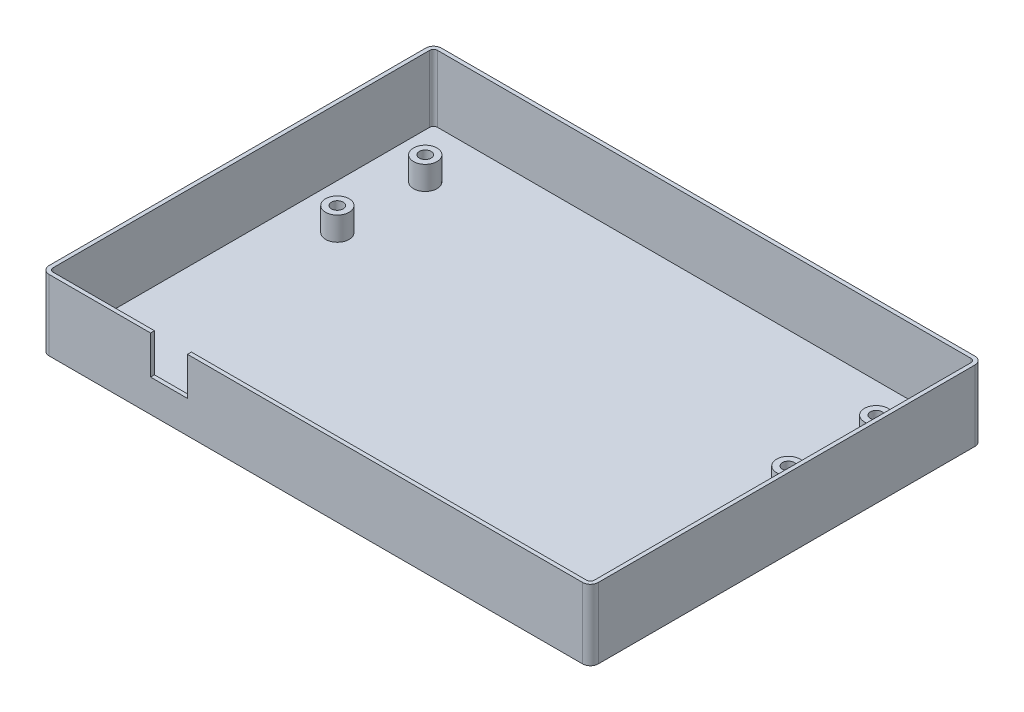
ISO-10303-21;
HEADER;
FILE_DESCRIPTION(('STEP AP214'),'2;1');
FILE_NAME('part.step','',(''),(''),'','','');
FILE_SCHEMA(('AUTOMOTIVE_DESIGN { 1 0 10303 214 1 1 1 1 }'));
ENDSEC;
DATA;
#1=APPLICATION_CONTEXT('core data for automotive mechanical design processes');
#2=APPLICATION_PROTOCOL_DEFINITION('international standard','automotive_design',2000,#1);
#3=PRODUCT_CONTEXT('',#1,'mechanical');
#4=PRODUCT('Part','Part','',(#3));
#5=PRODUCT_RELATED_PRODUCT_CATEGORY('part','',(#4));
#6=PRODUCT_DEFINITION_FORMATION('','',#4);
#7=PRODUCT_DEFINITION_CONTEXT('part definition',#1,'design');
#8=PRODUCT_DEFINITION('design','',#6,#7);
#9=PRODUCT_DEFINITION_SHAPE('','',#8);
#10=(LENGTH_UNIT() NAMED_UNIT(*) SI_UNIT(.MILLI.,.METRE.));
#11=(NAMED_UNIT(*) PLANE_ANGLE_UNIT() SI_UNIT($,.RADIAN.));
#12=(NAMED_UNIT(*) SI_UNIT($,.STERADIAN.) SOLID_ANGLE_UNIT());
#13=UNCERTAINTY_MEASURE_WITH_UNIT(LENGTH_MEASURE(1.E-05),#10,'distance_accuracy_value','');
#14=(GEOMETRIC_REPRESENTATION_CONTEXT(3) GLOBAL_UNCERTAINTY_ASSIGNED_CONTEXT((#13)) GLOBAL_UNIT_ASSIGNED_CONTEXT((#10,
#11,#12)) REPRESENTATION_CONTEXT('',''));
#15=CARTESIAN_POINT('',(0.,0.,0.));
#16=DIRECTION('',(0.,0.,1.));
#17=DIRECTION('',(1.,0.,0.));
#18=AXIS2_PLACEMENT_3D('',#15,#16,#17);
#19=CARTESIAN_POINT('',(68.,-3.,48.));
#20=DIRECTION('',(0.,1.,0.));
#21=DIRECTION('',(0.,0.,1.));
#22=AXIS2_PLACEMENT_3D('',#19,#20,#21);
#23=CYLINDRICAL_SURFACE('',#22,2.00000000000001);
#24=DIRECTION('',(0.,1.,0.));
#25=VECTOR('',#24,1.);
#26=CARTESIAN_POINT('',(70.,-3.,48.));
#27=LINE('',#26,#25);
#28=CARTESIAN_POINT('',(70.,-3.,48.));
#29=VERTEX_POINT('',#28);
#30=CARTESIAN_POINT('',(70.,15.,48.));
#31=VERTEX_POINT('',#30);
#32=EDGE_CURVE('E415',#29,#31,#27,.T.);
#33=ORIENTED_EDGE('',*,*,#32,.T.);
#34=CARTESIAN_POINT('',(68.,15.,48.));
#35=DIRECTION('',(0.,1.,0.));
#36=DIRECTION('',(0.,0.,1.));
#37=AXIS2_PLACEMENT_3D('',#34,#35,#36);
#38=CIRCLE('',#37,2.00000000000001);
#39=CARTESIAN_POINT('',(68.,15.,50.));
#40=VERTEX_POINT('',#39);
#41=EDGE_CURVE('E273',#40,#31,#38,.T.);
#42=ORIENTED_EDGE('',*,*,#41,.F.);
#43=DIRECTION('',(0.,1.,0.));
#44=VECTOR('',#43,1.);
#45=CARTESIAN_POINT('',(68.,-3.,50.));
#46=LINE('',#45,#44);
#47=CARTESIAN_POINT('',(68.,-3.,50.));
#48=VERTEX_POINT('',#47);
#49=EDGE_CURVE('E416',#48,#40,#46,.T.);
#50=ORIENTED_EDGE('',*,*,#49,.F.);
#51=CARTESIAN_POINT('',(68.,-3.,48.));
#52=DIRECTION('',(0.,1.,0.));
#53=DIRECTION('',(0.,0.,1.));
#54=AXIS2_PLACEMENT_3D('',#51,#52,#53);
#55=CIRCLE('',#54,2.00000000000001);
#56=EDGE_CURVE('E383',#48,#29,#55,.T.);
#57=ORIENTED_EDGE('',*,*,#56,.T.);
#58=EDGE_LOOP('',(#33,#42,#50,#57));
#59=FACE_BOUND('',#58,.T.);
#60=ADVANCED_FACE('F44',(#59),#23,.T.);
#61=CARTESIAN_POINT('',(-68.,-3.,50.));
#62=DIRECTION('',(0.,0.,1.));
#63=DIRECTION('',(1.,0.,0.));
#64=AXIS2_PLACEMENT_3D('',#61,#62,#63);
#65=PLANE('',#64);
#66=DIRECTION('',(0.,-1.,0.));
#67=VECTOR('',#66,1.);
#68=CARTESIAN_POINT('',(-42.167215363372,5.26014807806429,50.));
#69=LINE('',#68,#67);
#70=CARTESIAN_POINT('',(-42.167215363372,15.,50.));
#71=VERTEX_POINT('',#70);
#72=CARTESIAN_POINT('',(-42.167215363372,5.26014807806429,50.));
#73=VERTEX_POINT('',#72);
#74=EDGE_CURVE('E181',#71,#73,#69,.T.);
#75=ORIENTED_EDGE('',*,*,#74,.F.);
#76=DIRECTION('',(1.,0.,0.));
#77=VECTOR('',#76,1.);
#78=CARTESIAN_POINT('',(-68.,15.,50.));
#79=LINE('',#78,#77);
#80=CARTESIAN_POINT('',(-68.,15.,50.));
#81=VERTEX_POINT('',#80);
#82=EDGE_CURVE('E380',#81,#71,#79,.T.);
#83=ORIENTED_EDGE('',*,*,#82,.F.);
#84=DIRECTION('',(0.,1.,0.));
#85=VECTOR('',#84,1.);
#86=CARTESIAN_POINT('',(-68.,-3.,50.));
#87=LINE('',#86,#85);
#88=CARTESIAN_POINT('',(-68.,-3.,50.));
#89=VERTEX_POINT('',#88);
#90=EDGE_CURVE('E421',#89,#81,#87,.T.);
#91=ORIENTED_EDGE('',*,*,#90,.F.);
#92=DIRECTION('',(1.,0.,0.));
#93=VECTOR('',#92,1.);
#94=CARTESIAN_POINT('',(-68.,-3.,50.));
#95=LINE('',#94,#93);
#96=EDGE_CURVE('E411',#89,#48,#95,.T.);
#97=ORIENTED_EDGE('',*,*,#96,.T.);
#98=ORIENTED_EDGE('',*,*,#49,.T.);
#99=CARTESIAN_POINT('',(-32.7429575177416,15.,50.));
#100=VERTEX_POINT('',#99);
#101=EDGE_CURVE('E379',#100,#40,#79,.T.);
#102=ORIENTED_EDGE('',*,*,#101,.F.);
#103=DIRECTION('',(0.,1.,0.));
#104=VECTOR('',#103,1.);
#105=CARTESIAN_POINT('',(-32.7429575177416,5.26014807806429,50.));
#106=LINE('',#105,#104);
#107=CARTESIAN_POINT('',(-32.7429575177416,5.26014807806429,50.));
#108=VERTEX_POINT('',#107);
#109=EDGE_CURVE('E199',#108,#100,#106,.T.);
#110=ORIENTED_EDGE('',*,*,#109,.F.);
#111=DIRECTION('',(1.,0.,0.));
#112=VECTOR('',#111,1.);
#113=CARTESIAN_POINT('',(-42.167215363372,5.26014807806429,50.));
#114=LINE('',#113,#112);
#115=EDGE_CURVE('E192',#73,#108,#114,.T.);
#116=ORIENTED_EDGE('',*,*,#115,.F.);
#117=EDGE_LOOP('',(#75,#83,#91,#97,#98,#102,#110,#116));
#118=FACE_BOUND('',#117,.T.);
#119=ADVANCED_FACE('F201',(#118),#65,.T.);
#120=CARTESIAN_POINT('',(-68.,-3.,48.));
#121=DIRECTION('',(0.,1.,0.));
#122=DIRECTION('',(0.,0.,1.));
#123=AXIS2_PLACEMENT_3D('',#120,#121,#122);
#124=CYLINDRICAL_SURFACE('',#123,2.);
#125=ORIENTED_EDGE('',*,*,#90,.T.);
#126=CARTESIAN_POINT('',(-68.,15.,48.));
#127=DIRECTION('',(0.,1.,0.));
#128=DIRECTION('',(0.,0.,-1.));
#129=AXIS2_PLACEMENT_3D('',#126,#127,#128);
#130=CIRCLE('',#129,2.);
#131=CARTESIAN_POINT('',(-70.,15.,48.));
#132=VERTEX_POINT('',#131);
#133=EDGE_CURVE('E375',#132,#81,#130,.T.);
#134=ORIENTED_EDGE('',*,*,#133,.F.);
#135=DIRECTION('',(0.,1.,0.));
#136=VECTOR('',#135,1.);
#137=CARTESIAN_POINT('',(-70.,-3.,48.));
#138=LINE('',#137,#136);
#139=CARTESIAN_POINT('',(-70.,-3.,48.));
#140=VERTEX_POINT('',#139);
#141=EDGE_CURVE('E424',#140,#132,#138,.T.);
#142=ORIENTED_EDGE('',*,*,#141,.F.);
#143=CARTESIAN_POINT('',(-68.,-3.,48.));
#144=DIRECTION('',(0.,1.,0.));
#145=DIRECTION('',(0.,0.,-1.));
#146=AXIS2_PLACEMENT_3D('',#143,#144,#145);
#147=CIRCLE('',#146,2.);
#148=EDGE_CURVE('E407',#140,#89,#147,.T.);
#149=ORIENTED_EDGE('',*,*,#148,.T.);
#150=EDGE_LOOP('',(#125,#134,#142,#149));
#151=FACE_BOUND('',#150,.T.);
#152=ADVANCED_FACE('F499',(#151),#124,.T.);
#153=CARTESIAN_POINT('',(-70.,-3.,48.));
#154=DIRECTION('',(-1.,0.,0.));
#155=DIRECTION('',(0.,0.,1.));
#156=AXIS2_PLACEMENT_3D('',#153,#154,#155);
#157=PLANE('',#156);
#158=ORIENTED_EDGE('',*,*,#141,.T.);
#159=DIRECTION('',(0.,0.,1.));
#160=VECTOR('',#159,1.);
#161=CARTESIAN_POINT('',(-70.,15.,48.));
#162=LINE('',#161,#160);
#163=CARTESIAN_POINT('',(-70.,15.,-48.));
#164=VERTEX_POINT('',#163);
#165=EDGE_CURVE('E371',#164,#132,#162,.T.);
#166=ORIENTED_EDGE('',*,*,#165,.F.);
#167=DIRECTION('',(0.,1.,0.));
#168=VECTOR('',#167,1.);
#169=CARTESIAN_POINT('',(-70.,-3.,-48.));
#170=LINE('',#169,#168);
#171=CARTESIAN_POINT('',(-70.,-3.,-48.));
#172=VERTEX_POINT('',#171);
#173=EDGE_CURVE('E427',#172,#164,#170,.T.);
#174=ORIENTED_EDGE('',*,*,#173,.F.);
#175=DIRECTION('',(0.,0.,1.));
#176=VECTOR('',#175,1.);
#177=CARTESIAN_POINT('',(-70.,-3.,48.));
#178=LINE('',#177,#176);
#179=EDGE_CURVE('E403',#172,#140,#178,.T.);
#180=ORIENTED_EDGE('',*,*,#179,.T.);
#181=EDGE_LOOP('',(#158,#166,#174,#180));
#182=FACE_BOUND('',#181,.T.);
#183=ADVANCED_FACE('F497',(#182),#157,.T.);
#184=CARTESIAN_POINT('',(-68.,-3.,-48.));
#185=DIRECTION('',(0.,1.,0.));
#186=DIRECTION('',(0.,0.,1.));
#187=AXIS2_PLACEMENT_3D('',#184,#185,#186);
#188=CYLINDRICAL_SURFACE('',#187,2.);
#189=ORIENTED_EDGE('',*,*,#173,.T.);
#190=CARTESIAN_POINT('',(-68.,15.,-48.));
#191=DIRECTION('',(0.,1.,0.));
#192=DIRECTION('',(0.,0.,-1.));
#193=AXIS2_PLACEMENT_3D('',#190,#191,#192);
#194=CIRCLE('',#193,2.);
#195=CARTESIAN_POINT('',(-68.,15.,-50.));
#196=VERTEX_POINT('',#195);
#197=EDGE_CURVE('E367',#196,#164,#194,.T.);
#198=ORIENTED_EDGE('',*,*,#197,.F.);
#199=DIRECTION('',(0.,1.,0.));
#200=VECTOR('',#199,1.);
#201=CARTESIAN_POINT('',(-68.,-3.,-50.));
#202=LINE('',#201,#200);
#203=CARTESIAN_POINT('',(-68.,-3.,-50.));
#204=VERTEX_POINT('',#203);
#205=EDGE_CURVE('E430',#204,#196,#202,.T.);
#206=ORIENTED_EDGE('',*,*,#205,.F.);
#207=CARTESIAN_POINT('',(-68.,-3.,-48.));
#208=DIRECTION('',(0.,1.,0.));
#209=DIRECTION('',(0.,0.,-1.));
#210=AXIS2_PLACEMENT_3D('',#207,#208,#209);
#211=CIRCLE('',#210,2.);
#212=EDGE_CURVE('E399',#204,#172,#211,.T.);
#213=ORIENTED_EDGE('',*,*,#212,.T.);
#214=EDGE_LOOP('',(#189,#198,#206,#213));
#215=FACE_BOUND('',#214,.T.);
#216=ADVANCED_FACE('F492',(#215),#188,.T.);
#217=CARTESIAN_POINT('',(-68.,-3.,-50.));
#218=DIRECTION('',(0.,0.,-1.));
#219=DIRECTION('',(-1.,0.,0.));
#220=AXIS2_PLACEMENT_3D('',#217,#218,#219);
#221=PLANE('',#220);
#222=ORIENTED_EDGE('',*,*,#205,.T.);
#223=DIRECTION('',(-1.,0.,0.));
#224=VECTOR('',#223,1.);
#225=CARTESIAN_POINT('',(-68.,15.,-50.));
#226=LINE('',#225,#224);
#227=CARTESIAN_POINT('',(68.,15.,-50.));
#228=VERTEX_POINT('',#227);
#229=EDGE_CURVE('E363',#228,#196,#226,.T.);
#230=ORIENTED_EDGE('',*,*,#229,.F.);
#231=DIRECTION('',(0.,1.,0.));
#232=VECTOR('',#231,1.);
#233=CARTESIAN_POINT('',(68.,-3.,-50.));
#234=LINE('',#233,#232);
#235=CARTESIAN_POINT('',(68.,-3.,-50.));
#236=VERTEX_POINT('',#235);
#237=EDGE_CURVE('E433',#236,#228,#234,.T.);
#238=ORIENTED_EDGE('',*,*,#237,.F.);
#239=DIRECTION('',(-1.,0.,0.));
#240=VECTOR('',#239,1.);
#241=CARTESIAN_POINT('',(-68.,-3.,-50.));
#242=LINE('',#241,#240);
#243=EDGE_CURVE('E395',#236,#204,#242,.T.);
#244=ORIENTED_EDGE('',*,*,#243,.T.);
#245=EDGE_LOOP('',(#222,#230,#238,#244));
#246=FACE_BOUND('',#245,.T.);
#247=ADVANCED_FACE('F485',(#246),#221,.T.);
#248=CARTESIAN_POINT('',(68.,-3.,-48.));
#249=DIRECTION('',(0.,1.,0.));
#250=DIRECTION('',(0.,0.,1.));
#251=AXIS2_PLACEMENT_3D('',#248,#249,#250);
#252=CYLINDRICAL_SURFACE('',#251,2.00000000000001);
#253=ORIENTED_EDGE('',*,*,#237,.T.);
#254=CARTESIAN_POINT('',(68.,15.,-48.));
#255=DIRECTION('',(0.,1.,0.));
#256=DIRECTION('',(0.,0.,-1.));
#257=AXIS2_PLACEMENT_3D('',#254,#255,#256);
#258=CIRCLE('',#257,2.00000000000001);
#259=CARTESIAN_POINT('',(70.,15.,-48.));
#260=VERTEX_POINT('',#259);
#261=EDGE_CURVE('E359',#260,#228,#258,.T.);
#262=ORIENTED_EDGE('',*,*,#261,.F.);
#263=DIRECTION('',(0.,1.,0.));
#264=VECTOR('',#263,1.);
#265=CARTESIAN_POINT('',(70.,-3.,-48.));
#266=LINE('',#265,#264);
#267=CARTESIAN_POINT('',(70.,-3.,-48.));
#268=VERTEX_POINT('',#267);
#269=EDGE_CURVE('E436',#268,#260,#266,.T.);
#270=ORIENTED_EDGE('',*,*,#269,.F.);
#271=CARTESIAN_POINT('',(68.,-3.,-48.));
#272=DIRECTION('',(0.,1.,0.));
#273=DIRECTION('',(0.,0.,-1.));
#274=AXIS2_PLACEMENT_3D('',#271,#272,#273);
#275=CIRCLE('',#274,2.00000000000001);
#276=EDGE_CURVE('E391',#268,#236,#275,.T.);
#277=ORIENTED_EDGE('',*,*,#276,.T.);
#278=EDGE_LOOP('',(#253,#262,#270,#277));
#279=FACE_BOUND('',#278,.T.);
#280=ADVANCED_FACE('F481',(#279),#252,.T.);
#281=CARTESIAN_POINT('',(70.,-3.,48.));
#282=DIRECTION('',(1.,0.,0.));
#283=DIRECTION('',(0.,0.,-1.));
#284=AXIS2_PLACEMENT_3D('',#281,#282,#283);
#285=PLANE('',#284);
#286=ORIENTED_EDGE('',*,*,#269,.T.);
#287=DIRECTION('',(0.,0.,-1.));
#288=VECTOR('',#287,1.);
#289=CARTESIAN_POINT('',(70.,15.,48.));
#290=LINE('',#289,#288);
#291=EDGE_CURVE('E355',#31,#260,#290,.T.);
#292=ORIENTED_EDGE('',*,*,#291,.F.);
#293=ORIENTED_EDGE('',*,*,#32,.F.);
#294=DIRECTION('',(0.,0.,-1.));
#295=VECTOR('',#294,1.);
#296=CARTESIAN_POINT('',(70.,-3.,48.));
#297=LINE('',#296,#295);
#298=EDGE_CURVE('E387',#29,#268,#297,.T.);
#299=ORIENTED_EDGE('',*,*,#298,.T.);
#300=EDGE_LOOP('',(#286,#292,#293,#299));
#301=FACE_BOUND('',#300,.T.);
#302=ADVANCED_FACE('F477',(#301),#285,.T.);
#303=CARTESIAN_POINT('',(68.,-3.,48.));
#304=DIRECTION('',(0.,1.,0.));
#305=DIRECTION('',(0.,0.,1.));
#306=AXIS2_PLACEMENT_3D('',#303,#304,#305);
#307=PLANE('',#306);
#308=ORIENTED_EDGE('',*,*,#56,.F.);
#309=ORIENTED_EDGE('',*,*,#96,.F.);
#310=ORIENTED_EDGE('',*,*,#148,.F.);
#311=ORIENTED_EDGE('',*,*,#179,.F.);
#312=ORIENTED_EDGE('',*,*,#212,.F.);
#313=ORIENTED_EDGE('',*,*,#243,.F.);
#314=ORIENTED_EDGE('',*,*,#276,.F.);
#315=ORIENTED_EDGE('',*,*,#298,.F.);
#316=EDGE_LOOP('',(#308,#309,#310,#311,#312,#313,#314,#315));
#317=FACE_BOUND('',#316,.T.);
#318=ADVANCED_FACE('F488',(#317),#307,.F.);
#319=CARTESIAN_POINT('',(68.,15.,48.));
#320=DIRECTION('',(0.,1.,0.));
#321=DIRECTION('',(0.,0.,1.));
#322=AXIS2_PLACEMENT_3D('',#319,#320,#321);
#323=PLANE('',#322);
#324=DIRECTION('',(0.,0.,1.));
#325=VECTOR('',#324,1.);
#326=CARTESIAN_POINT('',(-42.167215363372,15.,48.));
#327=LINE('',#326,#325);
#328=CARTESIAN_POINT('',(-42.167215363372,15.,49.));
#329=VERTEX_POINT('',#328);
#330=EDGE_CURVE('E186',#329,#71,#327,.T.);
#331=ORIENTED_EDGE('',*,*,#330,.F.);
#332=DIRECTION('',(1.,0.,0.));
#333=VECTOR('',#332,1.);
#334=CARTESIAN_POINT('',(68.,15.,49.));
#335=LINE('',#334,#333);
#336=CARTESIAN_POINT('',(-68.,15.,49.));
#337=VERTEX_POINT('',#336);
#338=EDGE_CURVE('E280',#337,#329,#335,.T.);
#339=ORIENTED_EDGE('',*,*,#338,.F.);
#340=CARTESIAN_POINT('',(-68.,15.,48.));
#341=DIRECTION('',(0.,1.,0.));
#342=DIRECTION('',(0.,0.,1.));
#343=AXIS2_PLACEMENT_3D('',#340,#341,#342);
#344=CIRCLE('',#343,1.);
#345=CARTESIAN_POINT('',(-69.,15.,48.));
#346=VERTEX_POINT('',#345);
#347=EDGE_CURVE('E67',#346,#337,#344,.T.);
#348=ORIENTED_EDGE('',*,*,#347,.F.);
#349=DIRECTION('',(0.,0.,1.));
#350=VECTOR('',#349,1.);
#351=CARTESIAN_POINT('',(-69.,15.,48.));
#352=LINE('',#351,#350);
#353=CARTESIAN_POINT('',(-69.,15.,-48.));
#354=VERTEX_POINT('',#353);
#355=EDGE_CURVE('E342',#354,#346,#352,.T.);
#356=ORIENTED_EDGE('',*,*,#355,.F.);
#357=CARTESIAN_POINT('',(-68.,15.,-48.));
#358=DIRECTION('',(0.,1.,0.));
#359=DIRECTION('',(0.,0.,1.));
#360=AXIS2_PLACEMENT_3D('',#357,#358,#359);
#361=CIRCLE('',#360,1.);
#362=CARTESIAN_POINT('',(-68.,15.,-49.));
#363=VERTEX_POINT('',#362);
#364=EDGE_CURVE('E338',#363,#354,#361,.T.);
#365=ORIENTED_EDGE('',*,*,#364,.F.);
#366=DIRECTION('',(-1.,0.,0.));
#367=VECTOR('',#366,1.);
#368=CARTESIAN_POINT('',(68.,15.,-49.));
#369=LINE('',#368,#367);
#370=CARTESIAN_POINT('',(68.,15.,-49.));
#371=VERTEX_POINT('',#370);
#372=EDGE_CURVE('E334',#371,#363,#369,.T.);
#373=ORIENTED_EDGE('',*,*,#372,.F.);
#374=CARTESIAN_POINT('',(68.,15.,-48.));
#375=DIRECTION('',(0.,1.,0.));
#376=DIRECTION('',(0.,0.,1.));
#377=AXIS2_PLACEMENT_3D('',#374,#375,#376);
#378=CIRCLE('',#377,1.00000000000001);
#379=CARTESIAN_POINT('',(69.,15.,-48.));
#380=VERTEX_POINT('',#379);
#381=EDGE_CURVE('E330',#380,#371,#378,.T.);
#382=ORIENTED_EDGE('',*,*,#381,.F.);
#383=DIRECTION('',(0.,0.,-1.));
#384=VECTOR('',#383,1.);
#385=CARTESIAN_POINT('',(69.,15.,48.));
#386=LINE('',#385,#384);
#387=CARTESIAN_POINT('',(69.,15.,48.));
#388=VERTEX_POINT('',#387);
#389=EDGE_CURVE('E326',#388,#380,#386,.T.);
#390=ORIENTED_EDGE('',*,*,#389,.F.);
#391=CARTESIAN_POINT('',(68.,15.,48.));
#392=DIRECTION('',(0.,1.,0.));
#393=DIRECTION('',(0.,0.,1.));
#394=AXIS2_PLACEMENT_3D('',#391,#392,#393);
#395=CIRCLE('',#394,1.00000000000001);
#396=CARTESIAN_POINT('',(68.,15.,49.));
#397=VERTEX_POINT('',#396);
#398=EDGE_CURVE('E260',#397,#388,#395,.T.);
#399=ORIENTED_EDGE('',*,*,#398,.F.);
#400=CARTESIAN_POINT('',(-32.7429575177416,15.,49.));
#401=VERTEX_POINT('',#400);
#402=EDGE_CURVE('E348',#401,#397,#335,.T.);
#403=ORIENTED_EDGE('',*,*,#402,.F.);
#404=DIRECTION('',(0.,0.,-1.));
#405=VECTOR('',#404,1.);
#406=CARTESIAN_POINT('',(-32.7429575177416,15.,48.));
#407=LINE('',#406,#405);
#408=EDGE_CURVE('E209',#100,#401,#407,.T.);
#409=ORIENTED_EDGE('',*,*,#408,.F.);
#410=ORIENTED_EDGE('',*,*,#101,.T.);
#411=ORIENTED_EDGE('',*,*,#41,.T.);
#412=ORIENTED_EDGE('',*,*,#291,.T.);
#413=ORIENTED_EDGE('',*,*,#261,.T.);
#414=ORIENTED_EDGE('',*,*,#229,.T.);
#415=ORIENTED_EDGE('',*,*,#197,.T.);
#416=ORIENTED_EDGE('',*,*,#165,.T.);
#417=ORIENTED_EDGE('',*,*,#133,.T.);
#418=ORIENTED_EDGE('',*,*,#82,.T.);
#419=EDGE_LOOP('',(#331,#339,#348,#356,#365,#373,#382,#390,#399,#403,#409,#410,#411,#412,#413,
#414,#415,#416,#417,#418));
#420=FACE_BOUND('',#419,.T.);
#421=ADVANCED_FACE('F466',(#420),#323,.T.);
#422=CARTESIAN_POINT('',(68.,-3.,48.));
#423=DIRECTION('',(0.,1.,0.));
#424=DIRECTION('',(0.,0.,1.));
#425=AXIS2_PLACEMENT_3D('',#422,#423,#424);
#426=CYLINDRICAL_SURFACE('',#425,1.00000000000001);
#427=DIRECTION('',(0.,1.,0.));
#428=VECTOR('',#427,1.);
#429=CARTESIAN_POINT('',(69.,-3.,48.));
#430=LINE('',#429,#428);
#431=CARTESIAN_POINT('',(69.,-2.,48.));
#432=VERTEX_POINT('',#431);
#433=EDGE_CURVE('E264',#432,#388,#430,.T.);
#434=ORIENTED_EDGE('',*,*,#433,.F.);
#435=CARTESIAN_POINT('',(68.,-2.,48.));
#436=DIRECTION('',(0.,1.,0.));
#437=DIRECTION('',(0.,0.,1.));
#438=AXIS2_PLACEMENT_3D('',#435,#436,#437);
#439=CIRCLE('',#438,1.00000000000001);
#440=CARTESIAN_POINT('',(68.,-2.,49.));
#441=VERTEX_POINT('',#440);
#442=EDGE_CURVE('E275',#441,#432,#439,.T.);
#443=ORIENTED_EDGE('',*,*,#442,.F.);
#444=DIRECTION('',(0.,1.,0.));
#445=VECTOR('',#444,1.);
#446=CARTESIAN_POINT('',(68.,-3.,49.));
#447=LINE('',#446,#445);
#448=EDGE_CURVE('E269',#441,#397,#447,.T.);
#449=ORIENTED_EDGE('',*,*,#448,.T.);
#450=ORIENTED_EDGE('',*,*,#398,.T.);
#451=EDGE_LOOP('',(#434,#443,#449,#450));
#452=FACE_BOUND('',#451,.T.);
#453=ADVANCED_FACE('F527',(#452),#426,.F.);
#454=CARTESIAN_POINT('',(-68.,-3.,49.));
#455=DIRECTION('',(0.,0.,1.));
#456=DIRECTION('',(1.,0.,0.));
#457=AXIS2_PLACEMENT_3D('',#454,#455,#456);
#458=PLANE('',#457);
#459=ORIENTED_EDGE('',*,*,#338,.T.);
#460=DIRECTION('',(0.,-1.,0.));
#461=VECTOR('',#460,1.);
#462=CARTESIAN_POINT('',(-42.167215363372,-3.,49.));
#463=LINE('',#462,#461);
#464=CARTESIAN_POINT('',(-42.167215363372,5.26014807806429,49.));
#465=VERTEX_POINT('',#464);
#466=EDGE_CURVE('E11',#329,#465,#463,.T.);
#467=ORIENTED_EDGE('',*,*,#466,.T.);
#468=DIRECTION('',(1.,0.,0.));
#469=VECTOR('',#468,1.);
#470=CARTESIAN_POINT('',(-68.,5.26014807806429,49.));
#471=LINE('',#470,#469);
#472=CARTESIAN_POINT('',(-32.7429575177416,5.26014807806429,49.));
#473=VERTEX_POINT('',#472);
#474=EDGE_CURVE('E197',#465,#473,#471,.T.);
#475=ORIENTED_EDGE('',*,*,#474,.T.);
#476=DIRECTION('',(0.,1.,0.));
#477=VECTOR('',#476,1.);
#478=CARTESIAN_POINT('',(-32.7429575177416,-3.,49.));
#479=LINE('',#478,#477);
#480=EDGE_CURVE('E52',#473,#401,#479,.T.);
#481=ORIENTED_EDGE('',*,*,#480,.T.);
#482=ORIENTED_EDGE('',*,*,#402,.T.);
#483=ORIENTED_EDGE('',*,*,#448,.F.);
#484=DIRECTION('',(1.,0.,0.));
#485=VECTOR('',#484,1.);
#486=CARTESIAN_POINT('',(68.,-2.,49.));
#487=LINE('',#486,#485);
#488=CARTESIAN_POINT('',(-68.,-2.,49.));
#489=VERTEX_POINT('',#488);
#490=EDGE_CURVE('E268',#489,#441,#487,.T.);
#491=ORIENTED_EDGE('',*,*,#490,.F.);
#492=DIRECTION('',(0.,1.,0.));
#493=VECTOR('',#492,1.);
#494=CARTESIAN_POINT('',(-68.,-3.,49.));
#495=LINE('',#494,#493);
#496=EDGE_CURVE('E274',#489,#337,#495,.T.);
#497=ORIENTED_EDGE('',*,*,#496,.T.);
#498=EDGE_LOOP('',(#459,#467,#475,#481,#482,#483,#491,#497));
#499=FACE_BOUND('',#498,.T.);
#500=ADVANCED_FACE('F461',(#499),#458,.F.);
#501=CARTESIAN_POINT('',(-68.,-3.,48.));
#502=DIRECTION('',(0.,1.,0.));
#503=DIRECTION('',(0.,0.,1.));
#504=AXIS2_PLACEMENT_3D('',#501,#502,#503);
#505=CYLINDRICAL_SURFACE('',#504,1.);
#506=ORIENTED_EDGE('',*,*,#496,.F.);
#507=CARTESIAN_POINT('',(-68.,-2.,48.));
#508=DIRECTION('',(0.,1.,0.));
#509=DIRECTION('',(0.,0.,1.));
#510=AXIS2_PLACEMENT_3D('',#507,#508,#509);
#511=CIRCLE('',#510,1.);
#512=CARTESIAN_POINT('',(-69.,-2.,48.));
#513=VERTEX_POINT('',#512);
#514=EDGE_CURVE('E287',#513,#489,#511,.T.);
#515=ORIENTED_EDGE('',*,*,#514,.F.);
#516=DIRECTION('',(0.,1.,0.));
#517=VECTOR('',#516,1.);
#518=CARTESIAN_POINT('',(-69.,-3.,48.));
#519=LINE('',#518,#517);
#520=EDGE_CURVE('E283',#513,#346,#519,.T.);
#521=ORIENTED_EDGE('',*,*,#520,.T.);
#522=ORIENTED_EDGE('',*,*,#347,.T.);
#523=EDGE_LOOP('',(#506,#515,#521,#522));
#524=FACE_BOUND('',#523,.T.);
#525=ADVANCED_FACE('F503',(#524),#505,.F.);
#526=CARTESIAN_POINT('',(-69.,-3.,48.));
#527=DIRECTION('',(-1.,0.,0.));
#528=DIRECTION('',(0.,0.,1.));
#529=AXIS2_PLACEMENT_3D('',#526,#527,#528);
#530=PLANE('',#529);
#531=ORIENTED_EDGE('',*,*,#520,.F.);
#532=DIRECTION('',(0.,0.,1.));
#533=VECTOR('',#532,1.);
#534=CARTESIAN_POINT('',(-69.,-2.,48.));
#535=LINE('',#534,#533);
#536=CARTESIAN_POINT('',(-69.,-2.,-48.));
#537=VERTEX_POINT('',#536);
#538=EDGE_CURVE('E294',#537,#513,#535,.T.);
#539=ORIENTED_EDGE('',*,*,#538,.F.);
#540=DIRECTION('',(0.,1.,0.));
#541=VECTOR('',#540,1.);
#542=CARTESIAN_POINT('',(-69.,-3.,-48.));
#543=LINE('',#542,#541);
#544=EDGE_CURVE('E290',#537,#354,#543,.T.);
#545=ORIENTED_EDGE('',*,*,#544,.T.);
#546=ORIENTED_EDGE('',*,*,#355,.T.);
#547=EDGE_LOOP('',(#531,#539,#545,#546));
#548=FACE_BOUND('',#547,.T.);
#549=ADVANCED_FACE('F509',(#548),#530,.F.);
#550=CARTESIAN_POINT('',(-68.,-3.,-48.));
#551=DIRECTION('',(0.,1.,0.));
#552=DIRECTION('',(0.,0.,1.));
#553=AXIS2_PLACEMENT_3D('',#550,#551,#552);
#554=CYLINDRICAL_SURFACE('',#553,1.);
#555=ORIENTED_EDGE('',*,*,#544,.F.);
#556=CARTESIAN_POINT('',(-68.,-2.,-48.));
#557=DIRECTION('',(0.,1.,0.));
#558=DIRECTION('',(0.,0.,1.));
#559=AXIS2_PLACEMENT_3D('',#556,#557,#558);
#560=CIRCLE('',#559,1.);
#561=CARTESIAN_POINT('',(-68.,-2.,-49.));
#562=VERTEX_POINT('',#561);
#563=EDGE_CURVE('E301',#562,#537,#560,.T.);
#564=ORIENTED_EDGE('',*,*,#563,.F.);
#565=DIRECTION('',(0.,1.,0.));
#566=VECTOR('',#565,1.);
#567=CARTESIAN_POINT('',(-68.,-3.,-49.));
#568=LINE('',#567,#566);
#569=EDGE_CURVE('E297',#562,#363,#568,.T.);
#570=ORIENTED_EDGE('',*,*,#569,.T.);
#571=ORIENTED_EDGE('',*,*,#364,.T.);
#572=EDGE_LOOP('',(#555,#564,#570,#571));
#573=FACE_BOUND('',#572,.T.);
#574=ADVANCED_FACE('F515',(#573),#554,.F.);
#575=CARTESIAN_POINT('',(-68.,-3.,-49.));
#576=DIRECTION('',(0.,0.,-1.));
#577=DIRECTION('',(-1.,0.,0.));
#578=AXIS2_PLACEMENT_3D('',#575,#576,#577);
#579=PLANE('',#578);
#580=ORIENTED_EDGE('',*,*,#569,.F.);
#581=DIRECTION('',(-1.,0.,0.));
#582=VECTOR('',#581,1.);
#583=CARTESIAN_POINT('',(68.,-2.,-49.));
#584=LINE('',#583,#582);
#585=CARTESIAN_POINT('',(68.,-2.,-49.));
#586=VERTEX_POINT('',#585);
#587=EDGE_CURVE('E308',#586,#562,#584,.T.);
#588=ORIENTED_EDGE('',*,*,#587,.F.);
#589=DIRECTION('',(0.,1.,0.));
#590=VECTOR('',#589,1.);
#591=CARTESIAN_POINT('',(68.,-3.,-49.));
#592=LINE('',#591,#590);
#593=EDGE_CURVE('E304',#586,#371,#592,.T.);
#594=ORIENTED_EDGE('',*,*,#593,.T.);
#595=ORIENTED_EDGE('',*,*,#372,.T.);
#596=EDGE_LOOP('',(#580,#588,#594,#595));
#597=FACE_BOUND('',#596,.T.);
#598=ADVANCED_FACE('F518',(#597),#579,.F.);
#599=CARTESIAN_POINT('',(68.,-3.,-48.));
#600=DIRECTION('',(0.,1.,0.));
#601=DIRECTION('',(0.,0.,1.));
#602=AXIS2_PLACEMENT_3D('',#599,#600,#601);
#603=CYLINDRICAL_SURFACE('',#602,1.00000000000001);
#604=ORIENTED_EDGE('',*,*,#593,.F.);
#605=CARTESIAN_POINT('',(68.,-2.,-48.));
#606=DIRECTION('',(0.,1.,0.));
#607=DIRECTION('',(0.,0.,1.));
#608=AXIS2_PLACEMENT_3D('',#605,#606,#607);
#609=CIRCLE('',#608,1.00000000000001);
#610=CARTESIAN_POINT('',(69.,-2.,-48.));
#611=VERTEX_POINT('',#610);
#612=EDGE_CURVE('E314',#611,#586,#609,.T.);
#613=ORIENTED_EDGE('',*,*,#612,.F.);
#614=DIRECTION('',(0.,1.,0.));
#615=VECTOR('',#614,1.);
#616=CARTESIAN_POINT('',(69.,-3.,-48.));
#617=LINE('',#616,#615);
#618=EDGE_CURVE('E267',#611,#380,#617,.T.);
#619=ORIENTED_EDGE('',*,*,#618,.T.);
#620=ORIENTED_EDGE('',*,*,#381,.T.);
#621=EDGE_LOOP('',(#604,#613,#619,#620));
#622=FACE_BOUND('',#621,.T.);
#623=ADVANCED_FACE('F521',(#622),#603,.F.);
#624=CARTESIAN_POINT('',(69.,-3.,48.));
#625=DIRECTION('',(1.,0.,0.));
#626=DIRECTION('',(0.,0.,-1.));
#627=AXIS2_PLACEMENT_3D('',#624,#625,#626);
#628=PLANE('',#627);
#629=ORIENTED_EDGE('',*,*,#618,.F.);
#630=DIRECTION('',(0.,0.,-1.));
#631=VECTOR('',#630,1.);
#632=CARTESIAN_POINT('',(69.,-2.,48.));
#633=LINE('',#632,#631);
#634=EDGE_CURVE('E279',#432,#611,#633,.T.);
#635=ORIENTED_EDGE('',*,*,#634,.F.);
#636=ORIENTED_EDGE('',*,*,#433,.T.);
#637=ORIENTED_EDGE('',*,*,#389,.T.);
#638=EDGE_LOOP('',(#629,#635,#636,#637));
#639=FACE_BOUND('',#638,.T.);
#640=ADVANCED_FACE('F523',(#639),#628,.F.);
#641=CARTESIAN_POINT('',(68.,-2.,48.));
#642=DIRECTION('',(0.,1.,0.));
#643=DIRECTION('',(0.,0.,1.));
#644=AXIS2_PLACEMENT_3D('',#641,#642,#643);
#645=PLANE('',#644);
#646=CARTESIAN_POINT('',(57.5,-2.,-35.3805356119619));
#647=DIRECTION('',(0.,1.,0.));
#648=DIRECTION('',(0.,0.,-1.));
#649=AXIS2_PLACEMENT_3D('',#646,#647,#648);
#650=CIRCLE('',#649,3.);
#651=CARTESIAN_POINT('',(57.5,-2.,-38.3805356119619));
#652=VERTEX_POINT('',#651);
#653=EDGE_CURVE('E216',#652,#652,#650,.T.);
#654=ORIENTED_EDGE('',*,*,#653,.F.);
#655=EDGE_LOOP('',(#654));
#656=FACE_BOUND('',#655,.T.);
#657=CARTESIAN_POINT('',(57.5,-2.,-12.9681644474123));
#658=DIRECTION('',(0.,1.,0.));
#659=DIRECTION('',(0.,0.,-1.));
#660=AXIS2_PLACEMENT_3D('',#657,#658,#659);
#661=CIRCLE('',#660,3.);
#662=CARTESIAN_POINT('',(57.5,-2.,-15.9681644474123));
#663=VERTEX_POINT('',#662);
#664=EDGE_CURVE('E228',#663,#663,#661,.T.);
#665=ORIENTED_EDGE('',*,*,#664,.F.);
#666=EDGE_LOOP('',(#665));
#667=FACE_BOUND('',#666,.T.);
#668=CARTESIAN_POINT('',(-57.5,-2.,-12.9681644474123));
#669=DIRECTION('',(0.,1.,0.));
#670=DIRECTION('',(0.,0.,1.));
#671=AXIS2_PLACEMENT_3D('',#668,#669,#670);
#672=CIRCLE('',#671,3.);
#673=CARTESIAN_POINT('',(-57.5,-2.,-9.96816444741234));
#674=VERTEX_POINT('',#673);
#675=EDGE_CURVE('E240',#674,#674,#672,.T.);
#676=ORIENTED_EDGE('',*,*,#675,.F.);
#677=EDGE_LOOP('',(#676));
#678=FACE_BOUND('',#677,.T.);
#679=CARTESIAN_POINT('',(-57.5,-2.,-35.3805356119619));
#680=DIRECTION('',(0.,1.,0.));
#681=DIRECTION('',(0.,0.,1.));
#682=AXIS2_PLACEMENT_3D('',#679,#680,#681);
#683=CIRCLE('',#682,3.);
#684=CARTESIAN_POINT('',(-57.5,-2.,-32.3805356119619));
#685=VERTEX_POINT('',#684);
#686=EDGE_CURVE('E255',#685,#685,#683,.T.);
#687=ORIENTED_EDGE('',*,*,#686,.F.);
#688=EDGE_LOOP('',(#687));
#689=FACE_BOUND('',#688,.T.);
#690=ORIENTED_EDGE('',*,*,#442,.T.);
#691=ORIENTED_EDGE('',*,*,#634,.T.);
#692=ORIENTED_EDGE('',*,*,#612,.T.);
#693=ORIENTED_EDGE('',*,*,#587,.T.);
#694=ORIENTED_EDGE('',*,*,#563,.T.);
#695=ORIENTED_EDGE('',*,*,#538,.T.);
#696=ORIENTED_EDGE('',*,*,#514,.T.);
#697=ORIENTED_EDGE('',*,*,#490,.T.);
#698=EDGE_LOOP('',(#690,#691,#692,#693,#694,#695,#696,#697));
#699=FACE_BOUND('',#698,.T.);
#700=ADVANCED_FACE('F505',(#656,#667,#678,#689,#699),#645,.T.);
#701=CARTESIAN_POINT('',(-57.5,4.,-35.3805356119619));
#702=DIRECTION('',(0.,1.,0.));
#703=DIRECTION('',(0.,0.,1.));
#704=AXIS2_PLACEMENT_3D('',#701,#702,#703);
#705=PLANE('',#704);
#706=CARTESIAN_POINT('',(-57.5,4.,-35.3805356119619));
#707=DIRECTION('',(0.,1.,0.));
#708=DIRECTION('',(0.,0.,1.));
#709=AXIS2_PLACEMENT_3D('',#706,#707,#708);
#710=CIRCLE('',#709,3.);
#711=CARTESIAN_POINT('',(-57.5,4.,-32.3805356119619));
#712=VERTEX_POINT('',#711);
#713=EDGE_CURVE('E256',#712,#712,#710,.T.);
#714=ORIENTED_EDGE('',*,*,#713,.T.);
#715=EDGE_LOOP('',(#714));
#716=FACE_BOUND('',#715,.T.);
#717=CARTESIAN_POINT('',(-57.5,4.,-35.3805356119619));
#718=DIRECTION('',(0.,1.,0.));
#719=DIRECTION('',(0.,0.,1.));
#720=AXIS2_PLACEMENT_3D('',#717,#718,#719);
#721=CIRCLE('',#720,1.5);
#722=CARTESIAN_POINT('',(-57.5,4.,-33.8805356119619));
#723=VERTEX_POINT('',#722);
#724=EDGE_CURVE('E251',#723,#723,#721,.T.);
#725=ORIENTED_EDGE('',*,*,#724,.F.);
#726=EDGE_LOOP('',(#725));
#727=FACE_BOUND('',#726,.T.);
#728=ADVANCED_FACE('F725',(#716,#727),#705,.T.);
#729=CARTESIAN_POINT('',(-57.5,4.,-35.3805356119619));
#730=DIRECTION('',(0.,-1.,0.));
#731=DIRECTION('',(0.,0.,-1.));
#732=AXIS2_PLACEMENT_3D('',#729,#730,#731);
#733=CYLINDRICAL_SURFACE('',#732,3.);
#734=ORIENTED_EDGE('',*,*,#713,.F.);
#735=EDGE_LOOP('',(#734));
#736=FACE_BOUND('',#735,.T.);
#737=ORIENTED_EDGE('',*,*,#686,.T.);
#738=EDGE_LOOP('',(#737));
#739=FACE_BOUND('',#738,.T.);
#740=ADVANCED_FACE('F715',(#736,#739),#733,.T.);
#741=CARTESIAN_POINT('',(-57.5,4.,-35.3805356119619));
#742=DIRECTION('',(0.,-1.,0.));
#743=DIRECTION('',(0.,0.,-1.));
#744=AXIS2_PLACEMENT_3D('',#741,#742,#743);
#745=CYLINDRICAL_SURFACE('',#744,1.5);
#746=ORIENTED_EDGE('',*,*,#724,.T.);
#747=EDGE_LOOP('',(#746));
#748=FACE_BOUND('',#747,.T.);
#749=CARTESIAN_POINT('',(-57.5,-2.,-35.3805356119619));
#750=DIRECTION('',(0.,1.,0.));
#751=DIRECTION('',(0.,0.,1.));
#752=AXIS2_PLACEMENT_3D('',#749,#750,#751);
#753=CIRCLE('',#752,1.5);
#754=CARTESIAN_POINT('',(-57.5,-2.,-33.8805356119619));
#755=VERTEX_POINT('',#754);
#756=EDGE_CURVE('E420',#755,#755,#753,.F.);
#757=ORIENTED_EDGE('',*,*,#756,.T.);
#758=EDGE_LOOP('',(#757));
#759=FACE_BOUND('',#758,.T.);
#760=ADVANCED_FACE('F711',(#748,#759),#745,.F.);
#761=ORIENTED_EDGE('',*,*,#756,.F.);
#762=EDGE_LOOP('',(#761));
#763=FACE_BOUND('',#762,.T.);
#764=ADVANCED_FACE('F704',(#763),#645,.T.);
#765=CARTESIAN_POINT('',(-57.5,4.,-12.9681644474123));
#766=DIRECTION('',(0.,1.,0.));
#767=DIRECTION('',(0.,0.,1.));
#768=AXIS2_PLACEMENT_3D('',#765,#766,#767);
#769=PLANE('',#768);
#770=CARTESIAN_POINT('',(-57.5,4.,-12.9681644474123));
#771=DIRECTION('',(0.,1.,0.));
#772=DIRECTION('',(0.,0.,1.));
#773=AXIS2_PLACEMENT_3D('',#770,#771,#772);
#774=CIRCLE('',#773,3.);
#775=CARTESIAN_POINT('',(-57.5,4.,-9.96816444741234));
#776=VERTEX_POINT('',#775);
#777=EDGE_CURVE('E239',#776,#776,#774,.T.);
#778=ORIENTED_EDGE('',*,*,#777,.T.);
#779=EDGE_LOOP('',(#778));
#780=FACE_BOUND('',#779,.T.);
#781=CARTESIAN_POINT('',(-57.5,4.,-12.9681644474123));
#782=DIRECTION('',(0.,1.,0.));
#783=DIRECTION('',(0.,0.,1.));
#784=AXIS2_PLACEMENT_3D('',#781,#782,#783);
#785=CIRCLE('',#784,1.5);
#786=CARTESIAN_POINT('',(-57.5,4.,-11.4681644474123));
#787=VERTEX_POINT('',#786);
#788=EDGE_CURVE('E244',#787,#787,#785,.T.);
#789=ORIENTED_EDGE('',*,*,#788,.F.);
#790=EDGE_LOOP('',(#789));
#791=FACE_BOUND('',#790,.T.);
#792=ADVANCED_FACE('F694',(#780,#791),#769,.T.);
#793=CARTESIAN_POINT('',(-57.5,4.,-12.9681644474123));
#794=DIRECTION('',(0.,-1.,0.));
#795=DIRECTION('',(0.,0.,-1.));
#796=AXIS2_PLACEMENT_3D('',#793,#794,#795);
#797=CYLINDRICAL_SURFACE('',#796,3.);
#798=ORIENTED_EDGE('',*,*,#777,.F.);
#799=EDGE_LOOP('',(#798));
#800=FACE_BOUND('',#799,.T.);
#801=ORIENTED_EDGE('',*,*,#675,.T.);
#802=EDGE_LOOP('',(#801));
#803=FACE_BOUND('',#802,.T.);
#804=ADVANCED_FACE('F684',(#800,#803),#797,.T.);
#805=CARTESIAN_POINT('',(-57.5,4.,-12.9681644474123));
#806=DIRECTION('',(0.,-1.,0.));
#807=DIRECTION('',(0.,0.,-1.));
#808=AXIS2_PLACEMENT_3D('',#805,#806,#807);
#809=CYLINDRICAL_SURFACE('',#808,1.5);
#810=ORIENTED_EDGE('',*,*,#788,.T.);
#811=EDGE_LOOP('',(#810));
#812=FACE_BOUND('',#811,.T.);
#813=CARTESIAN_POINT('',(-57.5,-2.,-12.9681644474123));
#814=DIRECTION('',(0.,1.,0.));
#815=DIRECTION('',(0.,0.,1.));
#816=AXIS2_PLACEMENT_3D('',#813,#814,#815);
#817=CIRCLE('',#816,1.5);
#818=CARTESIAN_POINT('',(-57.5,-2.,-11.4681644474123));
#819=VERTEX_POINT('',#818);
#820=EDGE_CURVE('E444',#819,#819,#817,.F.);
#821=ORIENTED_EDGE('',*,*,#820,.T.);
#822=EDGE_LOOP('',(#821));
#823=FACE_BOUND('',#822,.T.);
#824=ADVANCED_FACE('F680',(#812,#823),#809,.F.);
#825=ORIENTED_EDGE('',*,*,#820,.F.);
#826=EDGE_LOOP('',(#825));
#827=FACE_BOUND('',#826,.T.);
#828=ADVANCED_FACE('F673',(#827),#645,.T.);
#829=CARTESIAN_POINT('',(57.5,4.,-12.9681644474123));
#830=DIRECTION('',(0.,-1.,0.));
#831=DIRECTION('',(0.,0.,-1.));
#832=AXIS2_PLACEMENT_3D('',#829,#830,#831);
#833=PLANE('',#832);
#834=CARTESIAN_POINT('',(57.5,4.,-12.9681644474123));
#835=DIRECTION('',(0.,1.,0.));
#836=DIRECTION('',(0.,0.,-1.));
#837=AXIS2_PLACEMENT_3D('',#834,#835,#836);
#838=CIRCLE('',#837,3.);
#839=CARTESIAN_POINT('',(57.5,4.,-15.9681644474123));
#840=VERTEX_POINT('',#839);
#841=EDGE_CURVE('E227',#840,#840,#838,.T.);
#842=ORIENTED_EDGE('',*,*,#841,.T.);
#843=EDGE_LOOP('',(#842));
#844=FACE_BOUND('',#843,.T.);
#845=CARTESIAN_POINT('',(57.5,4.,-12.9681644474123));
#846=DIRECTION('',(0.,1.,0.));
#847=DIRECTION('',(0.,0.,-1.));
#848=AXIS2_PLACEMENT_3D('',#845,#846,#847);
#849=CIRCLE('',#848,1.5);
#850=CARTESIAN_POINT('',(57.5,4.,-14.4681644474123));
#851=VERTEX_POINT('',#850);
#852=EDGE_CURVE('E232',#851,#851,#849,.T.);
#853=ORIENTED_EDGE('',*,*,#852,.F.);
#854=EDGE_LOOP('',(#853));
#855=FACE_BOUND('',#854,.T.);
#856=ADVANCED_FACE('F663',(#844,#855),#833,.F.);
#857=CARTESIAN_POINT('',(57.5,4.,-12.9681644474123));
#858=DIRECTION('',(0.,-1.,0.));
#859=DIRECTION('',(0.,0.,-1.));
#860=AXIS2_PLACEMENT_3D('',#857,#858,#859);
#861=CYLINDRICAL_SURFACE('',#860,3.);
#862=ORIENTED_EDGE('',*,*,#841,.F.);
#863=EDGE_LOOP('',(#862));
#864=FACE_BOUND('',#863,.T.);
#865=ORIENTED_EDGE('',*,*,#664,.T.);
#866=EDGE_LOOP('',(#865));
#867=FACE_BOUND('',#866,.T.);
#868=ADVANCED_FACE('F653',(#864,#867),#861,.T.);
#869=CARTESIAN_POINT('',(57.5,4.,-12.9681644474123));
#870=DIRECTION('',(0.,-1.,0.));
#871=DIRECTION('',(0.,0.,-1.));
#872=AXIS2_PLACEMENT_3D('',#869,#870,#871);
#873=CYLINDRICAL_SURFACE('',#872,1.5);
#874=ORIENTED_EDGE('',*,*,#852,.T.);
#875=EDGE_LOOP('',(#874));
#876=FACE_BOUND('',#875,.T.);
#877=CARTESIAN_POINT('',(57.5,-2.,-12.9681644474123));
#878=DIRECTION('',(0.,1.,0.));
#879=DIRECTION('',(0.,0.,1.));
#880=AXIS2_PLACEMENT_3D('',#877,#878,#879);
#881=CIRCLE('',#880,1.5);
#882=CARTESIAN_POINT('',(57.5,-2.,-11.4681644474123));
#883=VERTEX_POINT('',#882);
#884=EDGE_CURVE('E448',#883,#883,#881,.F.);
#885=ORIENTED_EDGE('',*,*,#884,.T.);
#886=EDGE_LOOP('',(#885));
#887=FACE_BOUND('',#886,.T.);
#888=ADVANCED_FACE('F649',(#876,#887),#873,.F.);
#889=ORIENTED_EDGE('',*,*,#884,.F.);
#890=EDGE_LOOP('',(#889));
#891=FACE_BOUND('',#890,.T.);
#892=ADVANCED_FACE('F642',(#891),#645,.T.);
#893=CARTESIAN_POINT('',(57.5,4.,-35.3805356119619));
#894=DIRECTION('',(0.,-1.,0.));
#895=DIRECTION('',(0.,0.,-1.));
#896=AXIS2_PLACEMENT_3D('',#893,#894,#895);
#897=PLANE('',#896);
#898=CARTESIAN_POINT('',(57.5,4.,-35.3805356119619));
#899=DIRECTION('',(0.,1.,0.));
#900=DIRECTION('',(0.,0.,-1.));
#901=AXIS2_PLACEMENT_3D('',#898,#899,#900);
#902=CIRCLE('',#901,3.);
#903=CARTESIAN_POINT('',(57.5,4.,-38.3805356119619));
#904=VERTEX_POINT('',#903);
#905=EDGE_CURVE('E215',#904,#904,#902,.T.);
#906=ORIENTED_EDGE('',*,*,#905,.T.);
#907=EDGE_LOOP('',(#906));
#908=FACE_BOUND('',#907,.T.);
#909=CARTESIAN_POINT('',(57.5,4.,-35.3805356119619));
#910=DIRECTION('',(0.,1.,0.));
#911=DIRECTION('',(0.,0.,-1.));
#912=AXIS2_PLACEMENT_3D('',#909,#910,#911);
#913=CIRCLE('',#912,1.5);
#914=CARTESIAN_POINT('',(57.5,4.,-36.8805356119619));
#915=VERTEX_POINT('',#914);
#916=EDGE_CURVE('E220',#915,#915,#913,.T.);
#917=ORIENTED_EDGE('',*,*,#916,.F.);
#918=EDGE_LOOP('',(#917));
#919=FACE_BOUND('',#918,.T.);
#920=ADVANCED_FACE('F632',(#908,#919),#897,.F.);
#921=CARTESIAN_POINT('',(57.5,4.,-35.3805356119619));
#922=DIRECTION('',(0.,-1.,0.));
#923=DIRECTION('',(0.,0.,-1.));
#924=AXIS2_PLACEMENT_3D('',#921,#922,#923);
#925=CYLINDRICAL_SURFACE('',#924,3.);
#926=ORIENTED_EDGE('',*,*,#905,.F.);
#927=EDGE_LOOP('',(#926));
#928=FACE_BOUND('',#927,.T.);
#929=ORIENTED_EDGE('',*,*,#653,.T.);
#930=EDGE_LOOP('',(#929));
#931=FACE_BOUND('',#930,.T.);
#932=ADVANCED_FACE('F622',(#928,#931),#925,.T.);
#933=CARTESIAN_POINT('',(57.5,4.,-35.3805356119619));
#934=DIRECTION('',(0.,-1.,0.));
#935=DIRECTION('',(0.,0.,-1.));
#936=AXIS2_PLACEMENT_3D('',#933,#934,#935);
#937=CYLINDRICAL_SURFACE('',#936,1.5);
#938=ORIENTED_EDGE('',*,*,#916,.T.);
#939=EDGE_LOOP('',(#938));
#940=FACE_BOUND('',#939,.T.);
#941=CARTESIAN_POINT('',(57.5,-2.,-35.3805356119619));
#942=DIRECTION('',(0.,1.,0.));
#943=DIRECTION('',(0.,0.,1.));
#944=AXIS2_PLACEMENT_3D('',#941,#942,#943);
#945=CIRCLE('',#944,1.5);
#946=CARTESIAN_POINT('',(57.5,-2.,-33.8805356119619));
#947=VERTEX_POINT('',#946);
#948=EDGE_CURVE('E452',#947,#947,#945,.F.);
#949=ORIENTED_EDGE('',*,*,#948,.T.);
#950=EDGE_LOOP('',(#949));
#951=FACE_BOUND('',#950,.T.);
#952=ADVANCED_FACE('F618',(#940,#951),#937,.F.);
#953=ORIENTED_EDGE('',*,*,#948,.F.);
#954=EDGE_LOOP('',(#953));
#955=FACE_BOUND('',#954,.T.);
#956=ADVANCED_FACE('F588',(#955),#645,.T.);
#957=CARTESIAN_POINT('',(-42.167215363372,5.26014807806429,40.));
#958=DIRECTION('',(0.,-1.,0.));
#959=DIRECTION('',(0.,0.,-1.));
#960=AXIS2_PLACEMENT_3D('',#957,#958,#959);
#961=PLANE('',#960);
#962=DIRECTION('',(0.,0.,1.));
#963=VECTOR('',#962,1.);
#964=CARTESIAN_POINT('',(-42.167215363372,5.26014807806429,40.));
#965=LINE('',#964,#963);
#966=EDGE_CURVE('E184',#465,#73,#965,.T.);
#967=ORIENTED_EDGE('',*,*,#966,.T.);
#968=ORIENTED_EDGE('',*,*,#115,.T.);
#969=DIRECTION('',(0.,0.,1.));
#970=VECTOR('',#969,1.);
#971=CARTESIAN_POINT('',(-32.7429575177416,5.26014807806429,40.));
#972=LINE('',#971,#970);
#973=EDGE_CURVE('E59',#473,#108,#972,.T.);
#974=ORIENTED_EDGE('',*,*,#973,.F.);
#975=ORIENTED_EDGE('',*,*,#474,.F.);
#976=EDGE_LOOP('',(#967,#968,#974,#975));
#977=FACE_BOUND('',#976,.T.);
#978=ADVANCED_FACE('F194',(#977),#961,.F.);
#979=CARTESIAN_POINT('',(-42.167215363372,5.26014807806429,40.));
#980=DIRECTION('',(-1.,0.,0.));
#981=DIRECTION('',(0.,0.,1.));
#982=AXIS2_PLACEMENT_3D('',#979,#980,#981);
#983=PLANE('',#982);
#984=ORIENTED_EDGE('',*,*,#330,.T.);
#985=ORIENTED_EDGE('',*,*,#74,.T.);
#986=ORIENTED_EDGE('',*,*,#966,.F.);
#987=ORIENTED_EDGE('',*,*,#466,.F.);
#988=EDGE_LOOP('',(#984,#985,#986,#987));
#989=FACE_BOUND('',#988,.T.);
#990=ADVANCED_FACE('F183',(#989),#983,.F.);
#991=CARTESIAN_POINT('',(-32.7429575177416,5.26014807806429,40.));
#992=DIRECTION('',(1.,0.,0.));
#993=DIRECTION('',(0.,0.,-1.));
#994=AXIS2_PLACEMENT_3D('',#991,#992,#993);
#995=PLANE('',#994);
#996=ORIENTED_EDGE('',*,*,#408,.T.);
#997=ORIENTED_EDGE('',*,*,#480,.F.);
#998=ORIENTED_EDGE('',*,*,#973,.T.);
#999=ORIENTED_EDGE('',*,*,#109,.T.);
#1000=EDGE_LOOP('',(#996,#997,#998,#999));
#1001=FACE_BOUND('',#1000,.T.);
#1002=ADVANCED_FACE('F600',(#1001),#995,.F.);
#1003=CLOSED_SHELL('',(#60,#119,#152,#183,#216,#247,#280,#302,#318,#421,#453,#500,#525,#549,
#574,#598,#623,#640,#700,#728,#740,#760,#764,#792,#804,#824,#828,#856,#868,#888,#892,#920,#932,
#952,#956,#978,#990,#1002));
#1004=MANIFOLD_SOLID_BREP('B2',#1003);
#1005=ADVANCED_BREP_SHAPE_REPRESENTATION('',(#18,#1004),#14);
#1006=SHAPE_DEFINITION_REPRESENTATION(#9,#1005);
ENDSEC;
END-ISO-10303-21;
